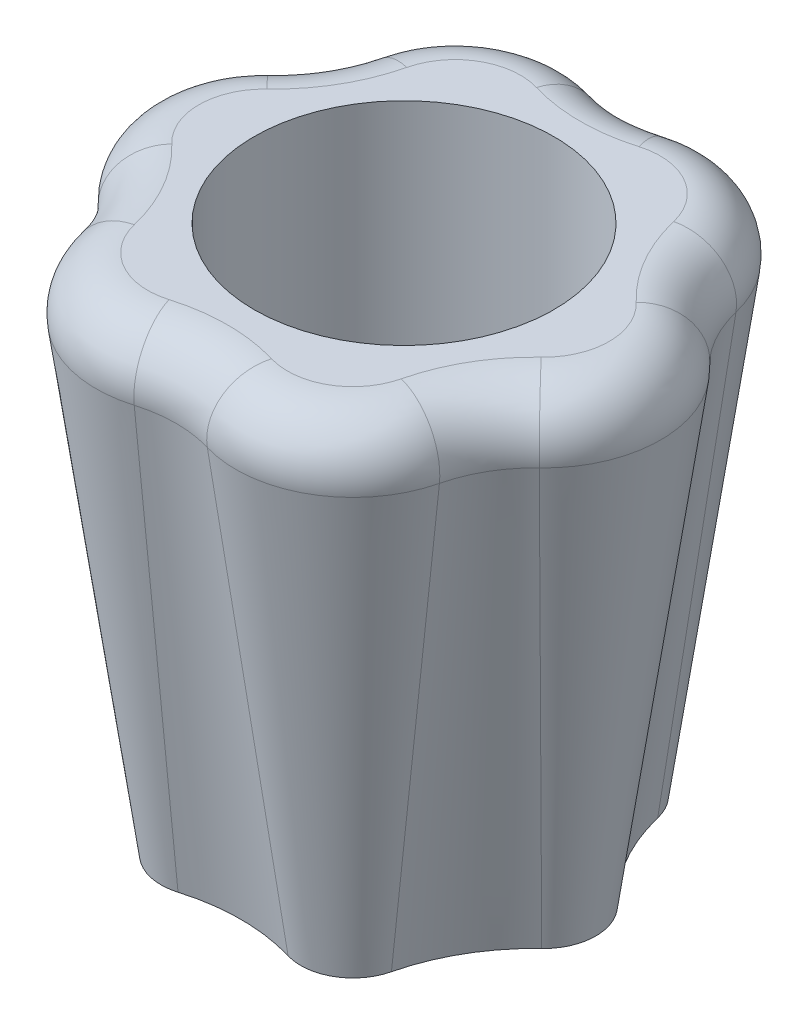
ISO-10303-21;
HEADER;
FILE_DESCRIPTION(('STEP AP214'),'2;1');
FILE_NAME('part.step','',(''),(''),'','','');
FILE_SCHEMA(('AUTOMOTIVE_DESIGN { 1 0 10303 214 1 1 1 1 }'));
ENDSEC;
DATA;
#1=APPLICATION_CONTEXT('core data for automotive mechanical design processes');
#2=APPLICATION_PROTOCOL_DEFINITION('international standard','automotive_design',2000,#1);
#3=PRODUCT_CONTEXT('',#1,'mechanical');
#4=PRODUCT('Part','Part','',(#3));
#5=PRODUCT_RELATED_PRODUCT_CATEGORY('part','',(#4));
#6=PRODUCT_DEFINITION_FORMATION('','',#4);
#7=PRODUCT_DEFINITION_CONTEXT('part definition',#1,'design');
#8=PRODUCT_DEFINITION('design','',#6,#7);
#9=PRODUCT_DEFINITION_SHAPE('','',#8);
#10=(LENGTH_UNIT() NAMED_UNIT(*) SI_UNIT(.MILLI.,.METRE.));
#11=(NAMED_UNIT(*) PLANE_ANGLE_UNIT() SI_UNIT($,.RADIAN.));
#12=(NAMED_UNIT(*) SI_UNIT($,.STERADIAN.) SOLID_ANGLE_UNIT());
#13=UNCERTAINTY_MEASURE_WITH_UNIT(LENGTH_MEASURE(1.E-05),#10,'distance_accuracy_value','');
#14=(GEOMETRIC_REPRESENTATION_CONTEXT(3) GLOBAL_UNCERTAINTY_ASSIGNED_CONTEXT((#13)) GLOBAL_UNIT_ASSIGNED_CONTEXT((#10,
#11,#12)) REPRESENTATION_CONTEXT('',''));
#15=CARTESIAN_POINT('',(0.,0.,0.));
#16=DIRECTION('',(0.,0.,1.));
#17=DIRECTION('',(1.,0.,0.));
#18=AXIS2_PLACEMENT_3D('',#15,#16,#17);
#19=CARTESIAN_POINT('',(0.,10.,0.));
#20=DIRECTION('',(0.,1.,0.));
#21=DIRECTION('',(0.,0.,1.));
#22=AXIS2_PLACEMENT_3D('',#19,#20,#21);
#23=PLANE('',#22);
#24=CARTESIAN_POINT('',(1.33903272743298,10.,-2.3192727169115));
#25=DIRECTION('',(0.,1.,0.));
#26=DIRECTION('',(0.,0.,1.));
#27=AXIS2_PLACEMENT_3D('',#24,#25,#26);
#28=CIRCLE('',#27,1.25503993980291);
#29=CARTESIAN_POINT('',(2.55944817270289,10.,-2.61203779585216));
#30=VERTEX_POINT('',#29);
#31=CARTESIAN_POINT('',(0.982367000501564,10.,-3.52256603515647));
#32=VERTEX_POINT('',#31);
#33=EDGE_CURVE('E238',#30,#32,#28,.T.);
#34=ORIENTED_EDGE('',*,*,#33,.T.);
#35=CARTESIAN_POINT('',(0.,10.,-6.83680555555556));
#36=DIRECTION('',(0.,1.,0.));
#37=DIRECTION('',(0.,0.,1.));
#38=AXIS2_PLACEMENT_3D('',#35,#36,#37);
#39=CIRCLE('',#38,3.45676561575265);
#40=CARTESIAN_POINT('',(-0.982367000501626,10.,-3.52256603515644));
#41=VERTEX_POINT('',#40);
#42=EDGE_CURVE('E240',#32,#41,#39,.F.);
#43=ORIENTED_EDGE('',*,*,#42,.T.);
#44=CARTESIAN_POINT('',(-1.33903272743301,10.,-2.31927271691146));
#45=DIRECTION('',(0.,1.,0.));
#46=DIRECTION('',(0.,0.,1.));
#47=AXIS2_PLACEMENT_3D('',#44,#45,#46);
#48=CIRCLE('',#47,1.25503993980291);
#49=CARTESIAN_POINT('',(-2.55944817270292,10.,-2.61203779585212));
#50=VERTEX_POINT('',#49);
#51=EDGE_CURVE('E218',#41,#50,#48,.T.);
#52=ORIENTED_EDGE('',*,*,#51,.T.);
#53=CARTESIAN_POINT('',(-5.9208472918457,10.,-3.41840277777778));
#54=DIRECTION('',(0.,1.,0.));
#55=DIRECTION('',(0.,0.,1.));
#56=AXIS2_PLACEMENT_3D('',#53,#54,#55);
#57=CIRCLE('',#56,3.45676561575265);
#58=CARTESIAN_POINT('',(-3.54181517320452,10.,-0.910528239304317));
#59=VERTEX_POINT('',#58);
#60=EDGE_CURVE('E220',#50,#59,#57,.F.);
#61=ORIENTED_EDGE('',*,*,#60,.T.);
#62=CARTESIAN_POINT('',(-2.67806545486601,10.,0.));
#63=DIRECTION('',(0.,1.,0.));
#64=DIRECTION('',(0.,0.,1.));
#65=AXIS2_PLACEMENT_3D('',#62,#63,#64);
#66=CIRCLE('',#65,1.25503993980291);
#67=CARTESIAN_POINT('',(-3.54181517320452,10.,0.910528239304326));
#68=VERTEX_POINT('',#67);
#69=EDGE_CURVE('E222',#59,#68,#66,.T.);
#70=ORIENTED_EDGE('',*,*,#69,.T.);
#71=CARTESIAN_POINT('',(-5.92084729184569,10.,3.41840277777779));
#72=DIRECTION('',(0.,1.,0.));
#73=DIRECTION('',(0.,0.,1.));
#74=AXIS2_PLACEMENT_3D('',#71,#72,#73);
#75=CIRCLE('',#74,3.45676561575265);
#76=CARTESIAN_POINT('',(-2.55944817270291,10.,2.61203779585214));
#77=VERTEX_POINT('',#76);
#78=EDGE_CURVE('E224',#68,#77,#75,.F.);
#79=ORIENTED_EDGE('',*,*,#78,.T.);
#80=CARTESIAN_POINT('',(-1.33903272743299,10.,2.3192727169115));
#81=DIRECTION('',(0.,1.,0.));
#82=DIRECTION('',(0.,0.,1.));
#83=AXIS2_PLACEMENT_3D('',#80,#81,#82);
#84=CIRCLE('',#83,1.25503993980291);
#85=CARTESIAN_POINT('',(-0.982367000501589,10.,3.52256603515646));
#86=VERTEX_POINT('',#85);
#87=EDGE_CURVE('E226',#77,#86,#84,.T.);
#88=ORIENTED_EDGE('',*,*,#87,.T.);
#89=CARTESIAN_POINT('',(0.,10.,6.83680555555556));
#90=DIRECTION('',(0.,1.,0.));
#91=DIRECTION('',(0.,0.,1.));
#92=AXIS2_PLACEMENT_3D('',#89,#90,#91);
#93=CIRCLE('',#92,3.45676561575265);
#94=CARTESIAN_POINT('',(0.98236700050161,10.,3.52256603515645));
#95=VERTEX_POINT('',#94);
#96=EDGE_CURVE('E228',#86,#95,#93,.F.);
#97=ORIENTED_EDGE('',*,*,#96,.T.);
#98=CARTESIAN_POINT('',(1.339032727433,10.,2.31927271691148));
#99=DIRECTION('',(0.,1.,0.));
#100=DIRECTION('',(0.,0.,1.));
#101=AXIS2_PLACEMENT_3D('',#98,#99,#100);
#102=CIRCLE('',#101,1.25503993980291);
#103=CARTESIAN_POINT('',(2.55944817270292,10.,2.61203779585213));
#104=VERTEX_POINT('',#103);
#105=EDGE_CURVE('E230',#95,#104,#102,.T.);
#106=ORIENTED_EDGE('',*,*,#105,.T.);
#107=CARTESIAN_POINT('',(5.9208472918457,10.,3.41840277777778));
#108=DIRECTION('',(0.,1.,0.));
#109=DIRECTION('',(0.,0.,1.));
#110=AXIS2_PLACEMENT_3D('',#107,#108,#109);
#111=CIRCLE('',#110,3.45676561575265);
#112=CARTESIAN_POINT('',(3.54181517320453,10.,0.91052823930431));
#113=VERTEX_POINT('',#112);
#114=EDGE_CURVE('E232',#104,#113,#111,.F.);
#115=ORIENTED_EDGE('',*,*,#114,.T.);
#116=CARTESIAN_POINT('',(2.67806545486602,10.,0.));
#117=DIRECTION('',(0.,1.,0.));
#118=DIRECTION('',(0.,0.,1.));
#119=AXIS2_PLACEMENT_3D('',#116,#117,#118);
#120=CIRCLE('',#119,1.25503993980291);
#121=CARTESIAN_POINT('',(3.54181517320452,10.,-0.910528239304344));
#122=VERTEX_POINT('',#121);
#123=EDGE_CURVE('E234',#113,#122,#120,.T.);
#124=ORIENTED_EDGE('',*,*,#123,.T.);
#125=CARTESIAN_POINT('',(5.92084729184566,10.,-3.41840277777784));
#126=DIRECTION('',(0.,1.,0.));
#127=DIRECTION('',(0.,0.,1.));
#128=AXIS2_PLACEMENT_3D('',#125,#126,#127);
#129=CIRCLE('',#128,3.45676561575265);
#130=EDGE_CURVE('E236',#122,#30,#129,.F.);
#131=ORIENTED_EDGE('',*,*,#130,.T.);
#132=EDGE_LOOP('',(#34,#43,#52,#61,#70,#79,#88,#97,#106,#115,#124,#131));
#133=FACE_BOUND('',#132,.T.);
#134=CARTESIAN_POINT('',(0.,10.,0.));
#135=DIRECTION('',(0.,1.,0.));
#136=DIRECTION('',(0.,0.,1.));
#137=AXIS2_PLACEMENT_3D('',#134,#135,#136);
#138=CIRCLE('',#137,2.875);
#139=CARTESIAN_POINT('',(0.,10.,2.875));
#140=VERTEX_POINT('',#139);
#141=EDGE_CURVE('E306',#140,#140,#138,.T.);
#142=ORIENTED_EDGE('',*,*,#141,.F.);
#143=EDGE_LOOP('',(#142));
#144=FACE_BOUND('',#143,.T.);
#145=ADVANCED_FACE('F41',(#133,#144),#23,.T.);
#146=CARTESIAN_POINT('',(0.,0.,0.));
#147=DIRECTION('',(0.,1.,0.));
#148=DIRECTION('',(0.,0.,1.));
#149=AXIS2_PLACEMENT_3D('',#146,#147,#148);
#150=PLANE('',#149);
#151=CARTESIAN_POINT('',(0.,0.,0.));
#152=DIRECTION('',(0.,1.,0.));
#153=DIRECTION('',(0.,0.,1.));
#154=AXIS2_PLACEMENT_3D('',#151,#152,#153);
#155=CIRCLE('',#154,1.65);
#156=CARTESIAN_POINT('',(0.,0.,1.65));
#157=VERTEX_POINT('',#156);
#158=EDGE_CURVE('E301',#157,#157,#155,.T.);
#159=ORIENTED_EDGE('',*,*,#158,.T.);
#160=EDGE_LOOP('',(#159));
#161=FACE_BOUND('',#160,.T.);
#162=CARTESIAN_POINT('',(0.,0.,-6.83680555555556));
#163=DIRECTION('',(0.,1.,0.));
#164=DIRECTION('',(-0.866025403784433,0.,0.50000000000001));
#165=AXIS2_PLACEMENT_3D('',#162,#163,#164);
#166=CIRCLE('',#165,3.71180555555556);
#167=CARTESIAN_POINT('',(-1.05484597319522,0.,-3.27804166129577));
#168=VERTEX_POINT('',#167);
#169=CARTESIAN_POINT('',(1.05484597319516,0.,-3.2780416612958));
#170=VERTEX_POINT('',#169);
#171=EDGE_CURVE('E172',#168,#170,#166,.T.);
#172=ORIENTED_EDGE('',*,*,#171,.T.);
#173=CARTESIAN_POINT('',(1.33903272743298,0.,-2.3192727169115));
#174=DIRECTION('',(0.,1.,0.));
#175=DIRECTION('',(0.,0.,1.));
#176=AXIS2_PLACEMENT_3D('',#173,#174,#175);
#177=CIRCLE('',#176,1.);
#178=CARTESIAN_POINT('',(2.31144436674827,0.,-2.55254424051467));
#179=VERTEX_POINT('',#178);
#180=EDGE_CURVE('E204',#170,#179,#177,.F.);
#181=ORIENTED_EDGE('',*,*,#180,.T.);
#182=CARTESIAN_POINT('',(5.92084729184566,0.,-3.41840277777784));
#183=DIRECTION('',(0.,1.,0.));
#184=DIRECTION('',(-0.866025403784443,0.,-0.499999999999992));
#185=AXIS2_PLACEMENT_3D('',#182,#183,#184);
#186=CIRCLE('',#185,3.71180555555556);
#187=CARTESIAN_POINT('',(3.36629033994349,0.,-0.725497420781157));
#188=VERTEX_POINT('',#187);
#189=EDGE_CURVE('E312',#179,#188,#186,.T.);
#190=ORIENTED_EDGE('',*,*,#189,.T.);
#191=CARTESIAN_POINT('',(2.67806545486602,0.,0.));
#192=DIRECTION('',(0.,1.,0.));
#193=DIRECTION('',(0.,0.,1.));
#194=AXIS2_PLACEMENT_3D('',#191,#192,#193);
#195=CIRCLE('',#194,1.);
#196=CARTESIAN_POINT('',(3.3662903399435,0.,0.725497420781124));
#197=VERTEX_POINT('',#196);
#198=EDGE_CURVE('E177',#188,#197,#195,.F.);
#199=ORIENTED_EDGE('',*,*,#198,.T.);
#200=CARTESIAN_POINT('',(5.9208472918457,0.,3.41840277777778));
#201=DIRECTION('',(0.,1.,0.));
#202=DIRECTION('',(0.,0.,-1.));
#203=AXIS2_PLACEMENT_3D('',#200,#201,#202);
#204=CIRCLE('',#203,3.71180555555556);
#205=CARTESIAN_POINT('',(2.3114443667483,0.,2.55254424051464));
#206=VERTEX_POINT('',#205);
#207=EDGE_CURVE('E188',#197,#206,#204,.T.);
#208=ORIENTED_EDGE('',*,*,#207,.T.);
#209=CARTESIAN_POINT('',(1.339032727433,0.,2.31927271691148));
#210=DIRECTION('',(0.,1.,0.));
#211=DIRECTION('',(0.,0.,1.));
#212=AXIS2_PLACEMENT_3D('',#209,#210,#211);
#213=CIRCLE('',#212,1.);
#214=CARTESIAN_POINT('',(1.0548459731952,0.,3.27804166129578));
#215=VERTEX_POINT('',#214);
#216=EDGE_CURVE('E324',#206,#215,#213,.F.);
#217=ORIENTED_EDGE('',*,*,#216,.T.);
#218=CARTESIAN_POINT('',(0.,0.,6.83680555555556));
#219=DIRECTION('',(0.,1.,0.));
#220=DIRECTION('',(0.866025403784436,0.,-0.500000000000004));
#221=AXIS2_PLACEMENT_3D('',#218,#219,#220);
#222=CIRCLE('',#221,3.71180555555556);
#223=CARTESIAN_POINT('',(-1.05484597319518,0.,3.27804166129579));
#224=VERTEX_POINT('',#223);
#225=EDGE_CURVE('E189',#215,#224,#222,.T.);
#226=ORIENTED_EDGE('',*,*,#225,.T.);
#227=CARTESIAN_POINT('',(-1.33903272743299,0.,2.3192727169115));
#228=DIRECTION('',(0.,1.,0.));
#229=DIRECTION('',(0.,0.,1.));
#230=AXIS2_PLACEMENT_3D('',#227,#228,#229);
#231=CIRCLE('',#230,1.);
#232=CARTESIAN_POINT('',(-2.31144436674829,0.,2.55254424051466));
#233=VERTEX_POINT('',#232);
#234=EDGE_CURVE('E326',#224,#233,#231,.F.);
#235=ORIENTED_EDGE('',*,*,#234,.T.);
#236=CARTESIAN_POINT('',(-5.92084729184569,0.,3.41840277777779));
#237=DIRECTION('',(0.,1.,0.));
#238=DIRECTION('',(0.86602540378444,0.,0.499999999999998));
#239=AXIS2_PLACEMENT_3D('',#236,#237,#238);
#240=CIRCLE('',#239,3.71180555555556);
#241=CARTESIAN_POINT('',(-3.36629033994349,0.,0.725497420781141));
#242=VERTEX_POINT('',#241);
#243=EDGE_CURVE('E195',#233,#242,#240,.T.);
#244=ORIENTED_EDGE('',*,*,#243,.T.);
#245=CARTESIAN_POINT('',(-2.67806545486601,0.,0.));
#246=DIRECTION('',(0.,1.,0.));
#247=DIRECTION('',(0.,0.,1.));
#248=AXIS2_PLACEMENT_3D('',#245,#246,#247);
#249=CIRCLE('',#248,1.);
#250=CARTESIAN_POINT('',(-3.36629033994349,0.,-0.725497420781131));
#251=VERTEX_POINT('',#250);
#252=EDGE_CURVE('E328',#242,#251,#249,.F.);
#253=ORIENTED_EDGE('',*,*,#252,.T.);
#254=CARTESIAN_POINT('',(-5.9208472918457,0.,-3.41840277777778));
#255=DIRECTION('',(0.,1.,0.));
#256=DIRECTION('',(0.,0.,1.));
#257=AXIS2_PLACEMENT_3D('',#254,#255,#256);
#258=CIRCLE('',#257,3.71180555555556);
#259=CARTESIAN_POINT('',(-2.3114443667483,0.,-2.55254424051463));
#260=VERTEX_POINT('',#259);
#261=EDGE_CURVE('E174',#251,#260,#258,.T.);
#262=ORIENTED_EDGE('',*,*,#261,.T.);
#263=CARTESIAN_POINT('',(-1.33903272743301,0.,-2.31927271691146));
#264=DIRECTION('',(0.,1.,0.));
#265=DIRECTION('',(0.,0.,1.));
#266=AXIS2_PLACEMENT_3D('',#263,#264,#265);
#267=CIRCLE('',#266,1.);
#268=EDGE_CURVE('E169',#260,#168,#267,.F.);
#269=ORIENTED_EDGE('',*,*,#268,.T.);
#270=EDGE_LOOP('',(#172,#181,#190,#199,#208,#217,#226,#235,#244,#253,#262,#269));
#271=FACE_BOUND('',#270,.T.);
#272=ADVANCED_FACE('F171',(#161,#271),#150,.F.);
#273=CARTESIAN_POINT('',(-5.9208472918457,0.,-3.41840277777778));
#274=DIRECTION('',(0.,-1.,0.));
#275=DIRECTION('',(0.,0.,1.));
#276=AXIS2_PLACEMENT_3D('',#273,#274,#275);
#277=CONICAL_SURFACE('',#276,3.71180555555556,0.139626340159547);
#278=DIRECTION('',(-0.0957823914141188,0.99026806874157,-0.10096972578864));
#279=VECTOR('',#278,1.);
#280=CARTESIAN_POINT('',(-3.36629033994349,0.,-0.725497420781132));
#281=LINE('',#280,#279);
#282=CARTESIAN_POINT('',(-4.22334230101009,8.86082689903993,-1.62896516905824));
#283=VERTEX_POINT('',#282);
#284=EDGE_CURVE('E198',#251,#283,#281,.T.);
#285=ORIENTED_EDGE('',*,*,#284,.T.);
#286=CARTESIAN_POINT('',(-5.9208472918457,8.86082689903994,-3.41840277777778));
#287=DIRECTION('',(0.,-1.,0.));
#288=DIRECTION('',(0.,0.,-1.));
#289=AXIS2_PLACEMENT_3D('',#286,#287,#288);
#290=CIRCLE('',#289,2.46649754701108);
#291=CARTESIAN_POINT('',(-3.5223963687895,8.86082689903993,-2.84303913702303));
#292=VERTEX_POINT('',#291);
#293=EDGE_CURVE('E50',#283,#292,#290,.F.);
#294=ORIENTED_EDGE('',*,*,#293,.T.);
#295=DIRECTION('',(-0.13533354325317,0.99026806874157,-0.032465121305532));
#296=VECTOR('',#295,1.);
#297=CARTESIAN_POINT('',(-2.3114443667483,0.,-2.55254424051463));
#298=LINE('',#297,#296);
#299=EDGE_CURVE('E214',#292,#260,#298,.F.);
#300=ORIENTED_EDGE('',*,*,#299,.T.);
#301=ORIENTED_EDGE('',*,*,#261,.F.);
#302=EDGE_LOOP('',(#285,#294,#300,#301));
#303=FACE_BOUND('',#302,.T.);
#304=ADVANCED_FACE('F396',(#303),#277,.F.);
#305=CARTESIAN_POINT('',(0.,0.,-6.83680555555556));
#306=DIRECTION('',(0.,-1.,0.));
#307=DIRECTION('',(-0.866025403784433,0.,0.50000000000001));
#308=AXIS2_PLACEMENT_3D('',#305,#306,#307);
#309=CONICAL_SURFACE('',#308,3.71180555555556,0.139626340159547);
#310=DIRECTION('',(0.0395511518390495,0.99026806874157,-0.133434847094172));
#311=VECTOR('',#310,1.);
#312=CARTESIAN_POINT('',(-1.05484597319522,0.,-3.27804166129577));
#313=LINE('',#312,#311);
#314=CARTESIAN_POINT('',(-0.700945932220634,8.86082689903994,-4.47200430608127));
#315=VERTEX_POINT('',#314);
#316=EDGE_CURVE('E184',#168,#315,#313,.T.);
#317=ORIENTED_EDGE('',*,*,#316,.T.);
#318=CARTESIAN_POINT('',(0.,8.86082689903994,-6.83680555555556));
#319=DIRECTION('',(0.,-1.,0.));
#320=DIRECTION('',(0.,0.,-1.));
#321=AXIS2_PLACEMENT_3D('',#318,#319,#320);
#322=CIRCLE('',#321,2.46649754701108);
#323=CARTESIAN_POINT('',(0.700945932220543,8.86082689903993,-4.47200430608129));
#324=VERTEX_POINT('',#323);
#325=EDGE_CURVE('E207',#315,#324,#322,.F.);
#326=ORIENTED_EDGE('',*,*,#325,.T.);
#327=DIRECTION('',(-0.0395511518390535,0.99026806874157,-0.133434847094171));
#328=VECTOR('',#327,1.);
#329=CARTESIAN_POINT('',(1.05484597319516,0.,-3.2780416612958));
#330=LINE('',#329,#328);
#331=EDGE_CURVE('E178',#324,#170,#330,.F.);
#332=ORIENTED_EDGE('',*,*,#331,.T.);
#333=ORIENTED_EDGE('',*,*,#171,.F.);
#334=EDGE_LOOP('',(#317,#326,#332,#333));
#335=FACE_BOUND('',#334,.T.);
#336=ADVANCED_FACE('F182',(#335),#309,.F.);
#337=CARTESIAN_POINT('',(-5.92084729184569,0.,3.41840277777779));
#338=DIRECTION('',(0.,-1.,0.));
#339=DIRECTION('',(0.86602540378444,0.,0.499999999999998));
#340=AXIS2_PLACEMENT_3D('',#337,#338,#339);
#341=CONICAL_SURFACE('',#340,3.71180555555556,0.139626340159547);
#342=DIRECTION('',(-0.13533354325317,0.99026806874157,0.0324651213055316));
#343=VECTOR('',#342,1.);
#344=CARTESIAN_POINT('',(-2.31144436674829,0.,2.55254424051466));
#345=LINE('',#344,#343);
#346=CARTESIAN_POINT('',(-3.52239636878949,8.86082689903993,2.84303913702305));
#347=VERTEX_POINT('',#346);
#348=EDGE_CURVE('E215',#233,#347,#345,.T.);
#349=ORIENTED_EDGE('',*,*,#348,.T.);
#350=CARTESIAN_POINT('',(-5.92084729184569,8.86082689903994,3.41840277777779));
#351=DIRECTION('',(0.,-1.,0.));
#352=DIRECTION('',(0.,0.,-1.));
#353=AXIS2_PLACEMENT_3D('',#350,#351,#352);
#354=CIRCLE('',#353,2.46649754701108);
#355=CARTESIAN_POINT('',(-4.22334230101009,8.86082689903993,1.62896516905825));
#356=VERTEX_POINT('',#355);
#357=EDGE_CURVE('E257',#347,#356,#354,.F.);
#358=ORIENTED_EDGE('',*,*,#357,.T.);
#359=DIRECTION('',(-0.0957823914141184,0.99026806874157,0.100969725788641));
#360=VECTOR('',#359,1.);
#361=CARTESIAN_POINT('',(-3.36629033994349,0.,0.725497420781139));
#362=LINE('',#361,#360);
#363=EDGE_CURVE('E212',#356,#242,#362,.F.);
#364=ORIENTED_EDGE('',*,*,#363,.T.);
#365=ORIENTED_EDGE('',*,*,#243,.F.);
#366=EDGE_LOOP('',(#349,#358,#364,#365));
#367=FACE_BOUND('',#366,.T.);
#368=ADVANCED_FACE('F341',(#367),#341,.F.);
#369=CARTESIAN_POINT('',(5.9208472918457,0.,3.41840277777778));
#370=DIRECTION('',(0.,-1.,0.));
#371=DIRECTION('',(0.,0.,-1.));
#372=AXIS2_PLACEMENT_3D('',#369,#370,#371);
#373=CONICAL_SURFACE('',#372,3.71180555555556,0.139626340159547);
#374=DIRECTION('',(0.0957823914141185,0.99026806874157,0.10096972578864));
#375=VECTOR('',#374,1.);
#376=CARTESIAN_POINT('',(3.3662903399435,0.,0.725497420781124));
#377=LINE('',#376,#375);
#378=CARTESIAN_POINT('',(4.2233423010101,8.86082689903993,1.62896516905824));
#379=VERTEX_POINT('',#378);
#380=EDGE_CURVE('E208',#197,#379,#377,.T.);
#381=ORIENTED_EDGE('',*,*,#380,.T.);
#382=CARTESIAN_POINT('',(5.9208472918457,8.86082689903994,3.41840277777778));
#383=DIRECTION('',(0.,-1.,0.));
#384=DIRECTION('',(0.,0.,-1.));
#385=AXIS2_PLACEMENT_3D('',#382,#383,#384);
#386=CIRCLE('',#385,2.46649754701108);
#387=CARTESIAN_POINT('',(3.5223963687895,8.86082689903993,2.84303913702304));
#388=VERTEX_POINT('',#387);
#389=EDGE_CURVE('E249',#379,#388,#386,.F.);
#390=ORIENTED_EDGE('',*,*,#389,.T.);
#391=DIRECTION('',(0.13533354325317,0.99026806874157,0.0324651213055316));
#392=VECTOR('',#391,1.);
#393=CARTESIAN_POINT('',(2.3114443667483,0.,2.55254424051464));
#394=LINE('',#393,#392);
#395=EDGE_CURVE('E205',#388,#206,#394,.F.);
#396=ORIENTED_EDGE('',*,*,#395,.T.);
#397=ORIENTED_EDGE('',*,*,#207,.F.);
#398=EDGE_LOOP('',(#381,#390,#396,#397));
#399=FACE_BOUND('',#398,.T.);
#400=ADVANCED_FACE('F382',(#399),#373,.F.);
#401=CARTESIAN_POINT('',(0.,0.,6.83680555555556));
#402=DIRECTION('',(0.,-1.,0.));
#403=DIRECTION('',(0.866025403784436,0.,-0.500000000000004));
#404=AXIS2_PLACEMENT_3D('',#401,#402,#403);
#405=CONICAL_SURFACE('',#404,3.71180555555556,0.139626340159547);
#406=DIRECTION('',(-0.0395511518390508,0.99026806874157,0.133434847094172));
#407=VECTOR('',#406,1.);
#408=CARTESIAN_POINT('',(1.0548459731952,0.,3.27804166129578));
#409=LINE('',#408,#407);
#410=CARTESIAN_POINT('',(0.700945932220609,8.86082689903993,4.47200430608128));
#411=VERTEX_POINT('',#410);
#412=EDGE_CURVE('E211',#215,#411,#409,.T.);
#413=ORIENTED_EDGE('',*,*,#412,.T.);
#414=CARTESIAN_POINT('',(0.,8.86082689903994,6.83680555555556));
#415=DIRECTION('',(0.,-1.,0.));
#416=DIRECTION('',(0.,0.,-1.));
#417=AXIS2_PLACEMENT_3D('',#414,#415,#416);
#418=CIRCLE('',#417,2.46649754701108);
#419=CARTESIAN_POINT('',(-0.700945932220574,8.86082689903994,4.47200430608129));
#420=VERTEX_POINT('',#419);
#421=EDGE_CURVE('E253',#411,#420,#418,.F.);
#422=ORIENTED_EDGE('',*,*,#421,.T.);
#423=DIRECTION('',(0.0395511518390526,0.99026806874157,0.133434847094171));
#424=VECTOR('',#423,1.);
#425=CARTESIAN_POINT('',(-1.05484597319518,0.,3.27804166129579));
#426=LINE('',#425,#424);
#427=EDGE_CURVE('E209',#420,#224,#426,.F.);
#428=ORIENTED_EDGE('',*,*,#427,.T.);
#429=ORIENTED_EDGE('',*,*,#225,.F.);
#430=EDGE_LOOP('',(#413,#422,#428,#429));
#431=FACE_BOUND('',#430,.T.);
#432=ADVANCED_FACE('F391',(#431),#405,.F.);
#433=CARTESIAN_POINT('',(5.92084729184566,0.,-3.41840277777784));
#434=DIRECTION('',(0.,-1.,0.));
#435=DIRECTION('',(-0.866025403784443,0.,-0.499999999999992));
#436=AXIS2_PLACEMENT_3D('',#433,#434,#435);
#437=CONICAL_SURFACE('',#436,3.71180555555556,0.139626340159547);
#438=DIRECTION('',(0.13533354325317,0.99026806874157,-0.0324651213055326));
#439=VECTOR('',#438,1.);
#440=CARTESIAN_POINT('',(2.31144436674827,0.,-2.55254424051467));
#441=LINE('',#440,#439);
#442=CARTESIAN_POINT('',(3.52239636878947,8.86082689903993,-2.84303913702307));
#443=VERTEX_POINT('',#442);
#444=EDGE_CURVE('E203',#179,#443,#441,.T.);
#445=ORIENTED_EDGE('',*,*,#444,.T.);
#446=CARTESIAN_POINT('',(5.92084729184566,8.86082689903994,-3.41840277777784));
#447=DIRECTION('',(0.,-1.,0.));
#448=DIRECTION('',(0.,0.,-1.));
#449=AXIS2_PLACEMENT_3D('',#446,#447,#448);
#450=CIRCLE('',#449,2.46649754701108);
#451=CARTESIAN_POINT('',(4.22334230101008,8.86082689903993,-1.62896516905828));
#452=VERTEX_POINT('',#451);
#453=EDGE_CURVE('E245',#443,#452,#450,.F.);
#454=ORIENTED_EDGE('',*,*,#453,.T.);
#455=DIRECTION('',(0.0957823914141175,0.99026806874157,-0.100969725788641));
#456=VECTOR('',#455,1.);
#457=CARTESIAN_POINT('',(3.3662903399435,0.,-0.725497420781155));
#458=LINE('',#457,#456);
#459=EDGE_CURVE('E201',#452,#188,#458,.F.);
#460=ORIENTED_EDGE('',*,*,#459,.T.);
#461=ORIENTED_EDGE('',*,*,#189,.F.);
#462=EDGE_LOOP('',(#445,#454,#460,#461));
#463=FACE_BOUND('',#462,.T.);
#464=ADVANCED_FACE('F372',(#463),#437,.F.);
#465=CARTESIAN_POINT('',(1.33903272743298,0.,-2.3192727169115));
#466=DIRECTION('',(0.,1.,0.));
#467=DIRECTION('',(0.,0.,1.));
#468=AXIS2_PLACEMENT_3D('',#465,#466,#467);
#469=CONICAL_SURFACE('',#468,1.,0.139626340159547);
#470=ORIENTED_EDGE('',*,*,#331,.F.);
#471=CARTESIAN_POINT('',(1.33903272743298,8.86082689903994,-2.3192727169115));
#472=DIRECTION('',(0.,-1.,0.));
#473=DIRECTION('',(0.,0.,-1.));
#474=AXIS2_PLACEMENT_3D('',#471,#472,#473);
#475=CIRCLE('',#474,2.24530800854448);
#476=EDGE_CURVE('E243',#324,#443,#475,.T.);
#477=ORIENTED_EDGE('',*,*,#476,.T.);
#478=ORIENTED_EDGE('',*,*,#444,.F.);
#479=ORIENTED_EDGE('',*,*,#180,.F.);
#480=EDGE_LOOP('',(#470,#477,#478,#479));
#481=FACE_BOUND('',#480,.T.);
#482=ADVANCED_FACE('F368',(#481),#469,.T.);
#483=CARTESIAN_POINT('',(-2.67806545486601,0.,0.));
#484=DIRECTION('',(0.,1.,0.));
#485=DIRECTION('',(0.,0.,1.));
#486=AXIS2_PLACEMENT_3D('',#483,#484,#485);
#487=CONICAL_SURFACE('',#486,1.,0.139626340159547);
#488=ORIENTED_EDGE('',*,*,#363,.F.);
#489=CARTESIAN_POINT('',(-2.67806545486601,8.86082689903994,0.));
#490=DIRECTION('',(0.,-1.,0.));
#491=DIRECTION('',(0.,0.,-1.));
#492=AXIS2_PLACEMENT_3D('',#489,#490,#491);
#493=CIRCLE('',#492,2.24530800854448);
#494=EDGE_CURVE('E65',#356,#283,#493,.T.);
#495=ORIENTED_EDGE('',*,*,#494,.T.);
#496=ORIENTED_EDGE('',*,*,#284,.F.);
#497=ORIENTED_EDGE('',*,*,#252,.F.);
#498=EDGE_LOOP('',(#488,#495,#496,#497));
#499=FACE_BOUND('',#498,.T.);
#500=ADVANCED_FACE('F397',(#499),#487,.T.);
#501=CARTESIAN_POINT('',(-1.33903272743299,0.,2.3192727169115));
#502=DIRECTION('',(0.,1.,0.));
#503=DIRECTION('',(0.,0.,1.));
#504=AXIS2_PLACEMENT_3D('',#501,#502,#503);
#505=CONICAL_SURFACE('',#504,1.,0.139626340159547);
#506=ORIENTED_EDGE('',*,*,#427,.F.);
#507=CARTESIAN_POINT('',(-1.33903272743299,8.86082689903994,2.3192727169115));
#508=DIRECTION('',(0.,-1.,0.));
#509=DIRECTION('',(0.,0.,-1.));
#510=AXIS2_PLACEMENT_3D('',#507,#508,#509);
#511=CIRCLE('',#510,2.24530800854448);
#512=EDGE_CURVE('E255',#420,#347,#511,.T.);
#513=ORIENTED_EDGE('',*,*,#512,.T.);
#514=ORIENTED_EDGE('',*,*,#348,.F.);
#515=ORIENTED_EDGE('',*,*,#234,.F.);
#516=EDGE_LOOP('',(#506,#513,#514,#515));
#517=FACE_BOUND('',#516,.T.);
#518=ADVANCED_FACE('F394',(#517),#505,.T.);
#519=CARTESIAN_POINT('',(1.339032727433,0.,2.31927271691148));
#520=DIRECTION('',(0.,1.,0.));
#521=DIRECTION('',(0.,0.,1.));
#522=AXIS2_PLACEMENT_3D('',#519,#520,#521);
#523=CONICAL_SURFACE('',#522,1.,0.139626340159547);
#524=ORIENTED_EDGE('',*,*,#395,.F.);
#525=CARTESIAN_POINT('',(1.339032727433,8.86082689903994,2.31927271691148));
#526=DIRECTION('',(0.,-1.,0.));
#527=DIRECTION('',(0.,0.,-1.));
#528=AXIS2_PLACEMENT_3D('',#525,#526,#527);
#529=CIRCLE('',#528,2.24530800854448);
#530=EDGE_CURVE('E251',#388,#411,#529,.T.);
#531=ORIENTED_EDGE('',*,*,#530,.T.);
#532=ORIENTED_EDGE('',*,*,#412,.F.);
#533=ORIENTED_EDGE('',*,*,#216,.F.);
#534=EDGE_LOOP('',(#524,#531,#532,#533));
#535=FACE_BOUND('',#534,.T.);
#536=ADVANCED_FACE('F388',(#535),#523,.T.);
#537=CARTESIAN_POINT('',(2.67806545486602,0.,0.));
#538=DIRECTION('',(0.,1.,0.));
#539=DIRECTION('',(0.,0.,1.));
#540=AXIS2_PLACEMENT_3D('',#537,#538,#539);
#541=CONICAL_SURFACE('',#540,1.,0.139626340159547);
#542=ORIENTED_EDGE('',*,*,#459,.F.);
#543=CARTESIAN_POINT('',(2.67806545486602,8.86082689903994,0.));
#544=DIRECTION('',(0.,-1.,0.));
#545=DIRECTION('',(0.,0.,-1.));
#546=AXIS2_PLACEMENT_3D('',#543,#544,#545);
#547=CIRCLE('',#546,2.24530800854448);
#548=EDGE_CURVE('E247',#452,#379,#547,.T.);
#549=ORIENTED_EDGE('',*,*,#548,.T.);
#550=ORIENTED_EDGE('',*,*,#380,.F.);
#551=ORIENTED_EDGE('',*,*,#198,.F.);
#552=EDGE_LOOP('',(#542,#549,#550,#551));
#553=FACE_BOUND('',#552,.T.);
#554=ADVANCED_FACE('F379',(#553),#541,.T.);
#555=CARTESIAN_POINT('',(-1.33903272743301,0.,-2.31927271691146));
#556=DIRECTION('',(0.,1.,0.));
#557=DIRECTION('',(0.,0.,1.));
#558=AXIS2_PLACEMENT_3D('',#555,#556,#557);
#559=CONICAL_SURFACE('',#558,1.,0.139626340159547);
#560=ORIENTED_EDGE('',*,*,#299,.F.);
#561=CARTESIAN_POINT('',(-1.33903272743301,8.86082689903994,-2.31927271691146));
#562=DIRECTION('',(0.,-1.,0.));
#563=DIRECTION('',(0.,0.,-1.));
#564=AXIS2_PLACEMENT_3D('',#561,#562,#563);
#565=CIRCLE('',#564,2.24530800854448);
#566=EDGE_CURVE('E11',#292,#315,#565,.T.);
#567=ORIENTED_EDGE('',*,*,#566,.T.);
#568=ORIENTED_EDGE('',*,*,#316,.F.);
#569=ORIENTED_EDGE('',*,*,#268,.F.);
#570=EDGE_LOOP('',(#560,#567,#568,#569));
#571=FACE_BOUND('',#570,.T.);
#572=ADVANCED_FACE('F191',(#571),#559,.T.);
#573=CARTESIAN_POINT('',(0.,5.,0.));
#574=DIRECTION('',(0.,1.,0.));
#575=DIRECTION('',(0.,0.,1.));
#576=AXIS2_PLACEMENT_3D('',#573,#574,#575);
#577=CYLINDRICAL_SURFACE('',#576,2.875);
#578=CARTESIAN_POINT('',(0.,5.,0.));
#579=DIRECTION('',(0.,1.,0.));
#580=DIRECTION('',(0.,0.,1.));
#581=AXIS2_PLACEMENT_3D('',#578,#579,#580);
#582=CIRCLE('',#581,2.875);
#583=CARTESIAN_POINT('',(0.,5.,2.875));
#584=VERTEX_POINT('',#583);
#585=EDGE_CURVE('E309',#584,#584,#582,.T.);
#586=ORIENTED_EDGE('',*,*,#585,.F.);
#587=EDGE_LOOP('',(#586));
#588=FACE_BOUND('',#587,.T.);
#589=ORIENTED_EDGE('',*,*,#141,.T.);
#590=EDGE_LOOP('',(#589));
#591=FACE_BOUND('',#590,.T.);
#592=ADVANCED_FACE('F418',(#588,#591),#577,.F.);
#593=CARTESIAN_POINT('',(0.,5.,0.));
#594=DIRECTION('',(0.,1.,0.));
#595=DIRECTION('',(0.,0.,1.));
#596=AXIS2_PLACEMENT_3D('',#593,#594,#595);
#597=PLANE('',#596);
#598=CARTESIAN_POINT('',(0.,5.,0.));
#599=DIRECTION('',(0.,1.,0.));
#600=DIRECTION('',(0.,0.,1.));
#601=AXIS2_PLACEMENT_3D('',#598,#599,#600);
#602=CIRCLE('',#601,1.65);
#603=CARTESIAN_POINT('',(0.,5.,1.65));
#604=VERTEX_POINT('',#603);
#605=EDGE_CURVE('E295',#604,#604,#602,.T.);
#606=ORIENTED_EDGE('',*,*,#605,.F.);
#607=EDGE_LOOP('',(#606));
#608=FACE_BOUND('',#607,.T.);
#609=ORIENTED_EDGE('',*,*,#585,.T.);
#610=EDGE_LOOP('',(#609));
#611=FACE_BOUND('',#610,.T.);
#612=ADVANCED_FACE('F477',(#608,#611),#597,.T.);
#613=CARTESIAN_POINT('',(0.,5.,0.));
#614=DIRECTION('',(0.,1.,0.));
#615=DIRECTION('',(0.,0.,1.));
#616=AXIS2_PLACEMENT_3D('',#613,#614,#615);
#617=CYLINDRICAL_SURFACE('',#616,1.65);
#618=ORIENTED_EDGE('',*,*,#158,.F.);
#619=EDGE_LOOP('',(#618));
#620=FACE_BOUND('',#619,.T.);
#621=ORIENTED_EDGE('',*,*,#605,.T.);
#622=EDGE_LOOP('',(#621));
#623=FACE_BOUND('',#622,.T.);
#624=ADVANCED_FACE('F472',(#620,#623),#617,.F.);
#625=CARTESIAN_POINT('',(0.,9.,6.83680555555556));
#626=DIRECTION('',(0.,1.,0.));
#627=DIRECTION('',(0.,0.,1.));
#628=AXIS2_PLACEMENT_3D('',#625,#626,#627);
#629=TOROIDAL_SURFACE('',#628,3.45676561575265,1.);
#630=CARTESIAN_POINT('',(0.98236700050161,9.,3.52256603515645));
#631=DIRECTION('',(0.958768944384299,0.,0.2841867542378));
#632=DIRECTION('',(0.2841867542378,0.,-0.9587689443843));
#633=AXIS2_PLACEMENT_3D('',#630,#631,#632);
#634=CIRCLE('',#633,1.);
#635=EDGE_CURVE('E288',#95,#411,#634,.T.);
#636=ORIENTED_EDGE('',*,*,#635,.F.);
#637=ORIENTED_EDGE('',*,*,#96,.F.);
#638=CARTESIAN_POINT('',(-0.982367000501589,9.,3.52256603515646));
#639=DIRECTION('',(-0.958768944384296,0.,0.284186754237813));
#640=DIRECTION('',(0.284186754237813,0.,0.958768944384296));
#641=AXIS2_PLACEMENT_3D('',#638,#639,#640);
#642=CIRCLE('',#641,1.);
#643=EDGE_CURVE('E45',#420,#86,#642,.T.);
#644=ORIENTED_EDGE('',*,*,#643,.F.);
#645=ORIENTED_EDGE('',*,*,#421,.F.);
#646=EDGE_LOOP('',(#636,#637,#644,#645));
#647=FACE_BOUND('',#646,.T.);
#648=ADVANCED_FACE('F43',(#647),#629,.T.);
#649=CARTESIAN_POINT('',(-1.33903272743299,9.,2.3192727169115));
#650=DIRECTION('',(0.,1.,0.));
#651=DIRECTION('',(0.,0.,1.));
#652=AXIS2_PLACEMENT_3D('',#649,#650,#651);
#653=TOROIDAL_SURFACE('',#652,1.25503993980291,1.);
#654=ORIENTED_EDGE('',*,*,#643,.T.);
#655=ORIENTED_EDGE('',*,*,#87,.F.);
#656=CARTESIAN_POINT('',(-2.55944817270291,9.,2.61203779585214));
#657=DIRECTION('',(-0.233271523603163,0.,-0.972411639315295));
#658=DIRECTION('',(-0.972411639315295,0.,0.233271523603163));
#659=AXIS2_PLACEMENT_3D('',#656,#657,#658);
#660=CIRCLE('',#659,1.);
#661=EDGE_CURVE('E286',#347,#77,#660,.T.);
#662=ORIENTED_EDGE('',*,*,#661,.F.);
#663=ORIENTED_EDGE('',*,*,#512,.F.);
#664=EDGE_LOOP('',(#654,#655,#662,#663));
#665=FACE_BOUND('',#664,.T.);
#666=ADVANCED_FACE('F345',(#665),#653,.T.);
#667=CARTESIAN_POINT('',(1.339032727433,9.,2.31927271691148));
#668=DIRECTION('',(0.,1.,0.));
#669=DIRECTION('',(0.,0.,1.));
#670=AXIS2_PLACEMENT_3D('',#667,#668,#669);
#671=TOROIDAL_SURFACE('',#670,1.25503993980291,1.);
#672=ORIENTED_EDGE('',*,*,#635,.T.);
#673=ORIENTED_EDGE('',*,*,#530,.F.);
#674=CARTESIAN_POINT('',(2.55944817270292,9.,2.61203779585213));
#675=DIRECTION('',(0.233271523603165,0.,-0.972411639315295));
#676=DIRECTION('',(-0.972411639315295,0.,-0.233271523603165));
#677=AXIS2_PLACEMENT_3D('',#674,#675,#676);
#678=CIRCLE('',#677,1.);
#679=EDGE_CURVE('E283',#104,#388,#678,.T.);
#680=ORIENTED_EDGE('',*,*,#679,.F.);
#681=ORIENTED_EDGE('',*,*,#105,.F.);
#682=EDGE_LOOP('',(#672,#673,#680,#681));
#683=FACE_BOUND('',#682,.T.);
#684=ADVANCED_FACE('F466',(#683),#671,.T.);
#685=CARTESIAN_POINT('',(-5.92084729184569,9.,3.41840277777779));
#686=DIRECTION('',(0.,1.,0.));
#687=DIRECTION('',(0.,0.,1.));
#688=AXIS2_PLACEMENT_3D('',#685,#686,#687);
#689=TOROIDAL_SURFACE('',#688,3.45676561575265,1.);
#690=ORIENTED_EDGE('',*,*,#661,.T.);
#691=ORIENTED_EDGE('',*,*,#78,.F.);
#692=CARTESIAN_POINT('',(-3.54181517320452,9.,0.910528239304325));
#693=DIRECTION('',(-0.725497420781137,0.,-0.688224885077485));
#694=DIRECTION('',(-0.688224885077485,0.,0.725497420781137));
#695=AXIS2_PLACEMENT_3D('',#692,#693,#694);
#696=CIRCLE('',#695,1.);
#697=EDGE_CURVE('E280',#356,#68,#696,.T.);
#698=ORIENTED_EDGE('',*,*,#697,.F.);
#699=ORIENTED_EDGE('',*,*,#357,.F.);
#700=EDGE_LOOP('',(#690,#691,#698,#699));
#701=FACE_BOUND('',#700,.T.);
#702=ADVANCED_FACE('F349',(#701),#689,.T.);
#703=CARTESIAN_POINT('',(5.9208472918457,9.,3.41840277777778));
#704=DIRECTION('',(0.,1.,0.));
#705=DIRECTION('',(0.,0.,1.));
#706=AXIS2_PLACEMENT_3D('',#703,#704,#705);
#707=TOROIDAL_SURFACE('',#706,3.45676561575265,1.);
#708=ORIENTED_EDGE('',*,*,#679,.T.);
#709=ORIENTED_EDGE('',*,*,#389,.F.);
#710=CARTESIAN_POINT('',(3.54181517320453,9.,0.91052823930431));
#711=DIRECTION('',(0.725497420781137,0.,-0.688224885077485));
#712=DIRECTION('',(-0.688224885077485,0.,-0.725497420781137));
#713=AXIS2_PLACEMENT_3D('',#710,#711,#712);
#714=CIRCLE('',#713,1.);
#715=EDGE_CURVE('E277',#113,#379,#714,.T.);
#716=ORIENTED_EDGE('',*,*,#715,.F.);
#717=ORIENTED_EDGE('',*,*,#114,.F.);
#718=EDGE_LOOP('',(#708,#709,#716,#717));
#719=FACE_BOUND('',#718,.T.);
#720=ADVANCED_FACE('F460',(#719),#707,.T.);
#721=CARTESIAN_POINT('',(-2.67806545486601,9.,0.));
#722=DIRECTION('',(0.,1.,0.));
#723=DIRECTION('',(0.,0.,1.));
#724=AXIS2_PLACEMENT_3D('',#721,#722,#723);
#725=TOROIDAL_SURFACE('',#724,1.25503993980291,1.);
#726=ORIENTED_EDGE('',*,*,#697,.T.);
#727=ORIENTED_EDGE('',*,*,#69,.F.);
#728=CARTESIAN_POINT('',(-3.54181517320452,9.,-0.910528239304317));
#729=DIRECTION('',(0.725497420781136,0.,-0.688224885077487));
#730=DIRECTION('',(-0.688224885077487,0.,-0.725497420781136));
#731=AXIS2_PLACEMENT_3D('',#728,#729,#730);
#732=CIRCLE('',#731,1.);
#733=EDGE_CURVE('E274',#283,#59,#732,.T.);
#734=ORIENTED_EDGE('',*,*,#733,.F.);
#735=ORIENTED_EDGE('',*,*,#494,.F.);
#736=EDGE_LOOP('',(#726,#727,#734,#735));
#737=FACE_BOUND('',#736,.T.);
#738=ADVANCED_FACE('F353',(#737),#725,.T.);
#739=CARTESIAN_POINT('',(2.67806545486602,9.,0.));
#740=DIRECTION('',(0.,1.,0.));
#741=DIRECTION('',(0.,0.,1.));
#742=AXIS2_PLACEMENT_3D('',#739,#740,#741);
#743=TOROIDAL_SURFACE('',#742,1.25503993980291,1.);
#744=ORIENTED_EDGE('',*,*,#715,.T.);
#745=ORIENTED_EDGE('',*,*,#548,.F.);
#746=CARTESIAN_POINT('',(3.54181517320452,9.,-0.910528239304344));
#747=DIRECTION('',(-0.725497420781144,0.,-0.688224885077478));
#748=DIRECTION('',(-0.688224885077478,0.,0.725497420781144));
#749=AXIS2_PLACEMENT_3D('',#746,#747,#748);
#750=CIRCLE('',#749,1.);
#751=EDGE_CURVE('E271',#122,#452,#750,.T.);
#752=ORIENTED_EDGE('',*,*,#751,.F.);
#753=ORIENTED_EDGE('',*,*,#123,.F.);
#754=EDGE_LOOP('',(#744,#745,#752,#753));
#755=FACE_BOUND('',#754,.T.);
#756=ADVANCED_FACE('F454',(#755),#743,.T.);
#757=CARTESIAN_POINT('',(-5.9208472918457,9.,-3.41840277777778));
#758=DIRECTION('',(0.,1.,0.));
#759=DIRECTION('',(0.,0.,1.));
#760=AXIS2_PLACEMENT_3D('',#757,#758,#759);
#761=TOROIDAL_SURFACE('',#760,3.45676561575265,1.);
#762=ORIENTED_EDGE('',*,*,#733,.T.);
#763=ORIENTED_EDGE('',*,*,#60,.F.);
#764=CARTESIAN_POINT('',(-2.55944817270292,9.,-2.61203779585212));
#765=DIRECTION('',(0.233271523603167,0.,-0.972411639315294));
#766=DIRECTION('',(-0.972411639315294,0.,-0.233271523603167));
#767=AXIS2_PLACEMENT_3D('',#764,#765,#766);
#768=CIRCLE('',#767,1.);
#769=EDGE_CURVE('E268',#292,#50,#768,.T.);
#770=ORIENTED_EDGE('',*,*,#769,.F.);
#771=ORIENTED_EDGE('',*,*,#293,.F.);
#772=EDGE_LOOP('',(#762,#763,#770,#771));
#773=FACE_BOUND('',#772,.T.);
#774=ADVANCED_FACE('F357',(#773),#761,.T.);
#775=CARTESIAN_POINT('',(5.92084729184566,9.,-3.41840277777784));
#776=DIRECTION('',(0.,1.,0.));
#777=DIRECTION('',(0.,0.,1.));
#778=AXIS2_PLACEMENT_3D('',#775,#776,#777);
#779=TOROIDAL_SURFACE('',#778,3.45676561575265,1.);
#780=ORIENTED_EDGE('',*,*,#751,.T.);
#781=ORIENTED_EDGE('',*,*,#453,.F.);
#782=CARTESIAN_POINT('',(2.55944817270289,9.,-2.61203779585216));
#783=DIRECTION('',(-0.233271523603171,0.,-0.972411639315293));
#784=DIRECTION('',(-0.972411639315293,0.,0.233271523603171));
#785=AXIS2_PLACEMENT_3D('',#782,#783,#784);
#786=CIRCLE('',#785,1.);
#787=EDGE_CURVE('E265',#30,#443,#786,.T.);
#788=ORIENTED_EDGE('',*,*,#787,.F.);
#789=ORIENTED_EDGE('',*,*,#130,.F.);
#790=EDGE_LOOP('',(#780,#781,#788,#789));
#791=FACE_BOUND('',#790,.T.);
#792=ADVANCED_FACE('F448',(#791),#779,.T.);
#793=CARTESIAN_POINT('',(-1.33903272743301,9.,-2.31927271691146));
#794=DIRECTION('',(0.,1.,0.));
#795=DIRECTION('',(0.,0.,1.));
#796=AXIS2_PLACEMENT_3D('',#793,#794,#795);
#797=TOROIDAL_SURFACE('',#796,1.25503993980291,1.);
#798=ORIENTED_EDGE('',*,*,#769,.T.);
#799=ORIENTED_EDGE('',*,*,#51,.F.);
#800=CARTESIAN_POINT('',(-0.982367000501626,9.,-3.52256603515644));
#801=DIRECTION('',(0.958768944384302,0.,0.284186754237791));
#802=DIRECTION('',(0.284186754237791,0.,-0.958768944384302));
#803=AXIS2_PLACEMENT_3D('',#800,#801,#802);
#804=CIRCLE('',#803,1.);
#805=EDGE_CURVE('E263',#315,#41,#804,.T.);
#806=ORIENTED_EDGE('',*,*,#805,.F.);
#807=ORIENTED_EDGE('',*,*,#566,.F.);
#808=EDGE_LOOP('',(#798,#799,#806,#807));
#809=FACE_BOUND('',#808,.T.);
#810=ADVANCED_FACE('F360',(#809),#797,.T.);
#811=CARTESIAN_POINT('',(1.33903272743298,9.,-2.3192727169115));
#812=DIRECTION('',(0.,1.,0.));
#813=DIRECTION('',(0.,0.,1.));
#814=AXIS2_PLACEMENT_3D('',#811,#812,#813);
#815=TOROIDAL_SURFACE('',#814,1.25503993980291,1.);
#816=ORIENTED_EDGE('',*,*,#787,.T.);
#817=ORIENTED_EDGE('',*,*,#476,.F.);
#818=CARTESIAN_POINT('',(0.982367000501564,9.,-3.52256603515647));
#819=DIRECTION('',(-0.958768944384294,0.,0.28418675423782));
#820=DIRECTION('',(0.28418675423782,0.,0.958768944384294));
#821=AXIS2_PLACEMENT_3D('',#818,#819,#820);
#822=CIRCLE('',#821,1.);
#823=EDGE_CURVE('E261',#32,#324,#822,.T.);
#824=ORIENTED_EDGE('',*,*,#823,.F.);
#825=ORIENTED_EDGE('',*,*,#33,.F.);
#826=EDGE_LOOP('',(#816,#817,#824,#825));
#827=FACE_BOUND('',#826,.T.);
#828=ADVANCED_FACE('F442',(#827),#815,.T.);
#829=CARTESIAN_POINT('',(0.,9.,-6.83680555555556));
#830=DIRECTION('',(0.,1.,0.));
#831=DIRECTION('',(0.,0.,1.));
#832=AXIS2_PLACEMENT_3D('',#829,#830,#831);
#833=TOROIDAL_SURFACE('',#832,3.45676561575265,1.);
#834=ORIENTED_EDGE('',*,*,#805,.T.);
#835=ORIENTED_EDGE('',*,*,#42,.F.);
#836=ORIENTED_EDGE('',*,*,#823,.T.);
#837=ORIENTED_EDGE('',*,*,#325,.F.);
#838=EDGE_LOOP('',(#834,#835,#836,#837));
#839=FACE_BOUND('',#838,.T.);
#840=ADVANCED_FACE('F364',(#839),#833,.T.);
#841=CLOSED_SHELL('',(#145,#272,#304,#336,#368,#400,#432,#464,#482,#500,#518,#536,#554,#572,
#592,#612,#624,#648,#666,#684,#702,#720,#738,#756,#774,#792,#810,#828,#840));
#842=MANIFOLD_SOLID_BREP('B2',#841);
#843=ADVANCED_BREP_SHAPE_REPRESENTATION('',(#18,#842),#14);
#844=SHAPE_DEFINITION_REPRESENTATION(#9,#843);
ENDSEC;
END-ISO-10303-21;
